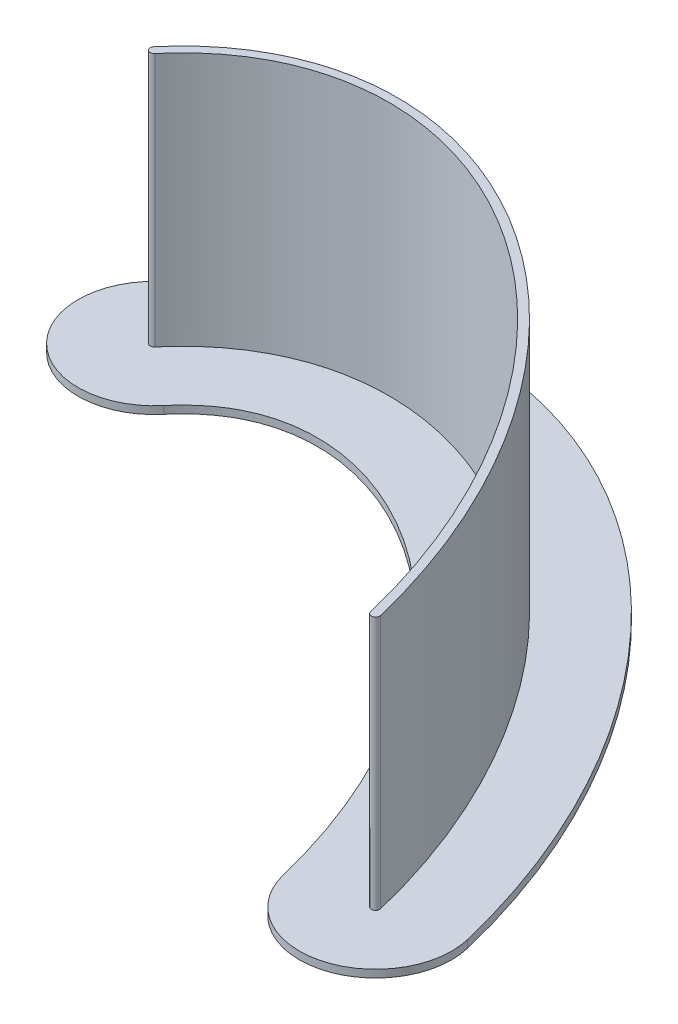
ISO-10303-21;
HEADER;
FILE_DESCRIPTION(('STEP AP214'),'2;1');
FILE_NAME('part.step','',(''),(''),'','','');
FILE_SCHEMA(('AUTOMOTIVE_DESIGN { 1 0 10303 214 1 1 1 1 }'));
ENDSEC;
DATA;
#1=APPLICATION_CONTEXT('core data for automotive mechanical design processes');
#2=APPLICATION_PROTOCOL_DEFINITION('international standard','automotive_design',2000,#1);
#3=PRODUCT_CONTEXT('',#1,'mechanical');
#4=PRODUCT('Part','Part','',(#3));
#5=PRODUCT_RELATED_PRODUCT_CATEGORY('part','',(#4));
#6=PRODUCT_DEFINITION_FORMATION('','',#4);
#7=PRODUCT_DEFINITION_CONTEXT('part definition',#1,'design');
#8=PRODUCT_DEFINITION('design','',#6,#7);
#9=PRODUCT_DEFINITION_SHAPE('','',#8);
#10=(LENGTH_UNIT() NAMED_UNIT(*) SI_UNIT(.MILLI.,.METRE.));
#11=(NAMED_UNIT(*) PLANE_ANGLE_UNIT() SI_UNIT($,.RADIAN.));
#12=(NAMED_UNIT(*) SI_UNIT($,.STERADIAN.) SOLID_ANGLE_UNIT());
#13=UNCERTAINTY_MEASURE_WITH_UNIT(LENGTH_MEASURE(1.E-05),#10,'distance_accuracy_value','');
#14=(GEOMETRIC_REPRESENTATION_CONTEXT(3) GLOBAL_UNCERTAINTY_ASSIGNED_CONTEXT((#13)) GLOBAL_UNIT_ASSIGNED_CONTEXT((#10,
#11,#12)) REPRESENTATION_CONTEXT('',''));
#15=CARTESIAN_POINT('',(0.,0.,0.));
#16=DIRECTION('',(0.,0.,1.));
#17=DIRECTION('',(1.,0.,0.));
#18=AXIS2_PLACEMENT_3D('',#15,#16,#17);
#19=CARTESIAN_POINT('',(23.8437160324077,100.,0.));
#20=DIRECTION('',(0.,-1.,0.));
#21=DIRECTION('',(0.,0.,-1.));
#22=AXIS2_PLACEMENT_3D('',#19,#20,#21);
#23=CYLINDRICAL_SURFACE('',#22,1.65);
#24=CARTESIAN_POINT('',(23.8437160324077,0.,0.));
#25=DIRECTION('',(0.,-1.,0.));
#26=DIRECTION('',(0.,0.,-1.));
#27=AXIS2_PLACEMENT_3D('',#24,#25,#26);
#28=CIRCLE('',#27,1.65);
#29=CARTESIAN_POINT('',(25.4477931258082,0.,-0.386570405524836));
#30=VERTEX_POINT('',#29);
#31=CARTESIAN_POINT('',(22.2396389390071,0.,0.386570405524822));
#32=VERTEX_POINT('',#31);
#33=EDGE_CURVE('E127',#30,#32,#28,.T.);
#34=ORIENTED_EDGE('',*,*,#33,.F.);
#35=DIRECTION('',(0.,-1.,0.));
#36=VECTOR('',#35,1.);
#37=CARTESIAN_POINT('',(25.4477931258082,100.,-0.386570405524836));
#38=LINE('',#37,#36);
#39=CARTESIAN_POINT('',(25.4477931258082,100.,-0.386570405524836));
#40=VERTEX_POINT('',#39);
#41=EDGE_CURVE('E11',#40,#30,#38,.T.);
#42=ORIENTED_EDGE('',*,*,#41,.F.);
#43=CARTESIAN_POINT('',(23.8437160324077,100.,0.));
#44=DIRECTION('',(0.,-1.,0.));
#45=DIRECTION('',(0.,0.,-1.));
#46=AXIS2_PLACEMENT_3D('',#43,#44,#45);
#47=CIRCLE('',#46,1.65);
#48=CARTESIAN_POINT('',(22.2396389390071,100.,0.386570405524822));
#49=VERTEX_POINT('',#48);
#50=EDGE_CURVE('E135',#40,#49,#47,.T.);
#51=ORIENTED_EDGE('',*,*,#50,.T.);
#52=DIRECTION('',(0.,-1.,0.));
#53=VECTOR('',#52,1.);
#54=CARTESIAN_POINT('',(22.2396389390071,100.,0.386570405524822));
#55=LINE('',#54,#53);
#56=EDGE_CURVE('E43',#49,#32,#55,.T.);
#57=ORIENTED_EDGE('',*,*,#56,.T.);
#58=EDGE_LOOP('',(#34,#42,#51,#57));
#59=FACE_BOUND('',#58,.T.);
#60=ADVANCED_FACE('F40',(#59),#23,.T.);
#61=CARTESIAN_POINT('',(25.4477931258082,100.,-0.386570405524836));
#62=CARTESIAN_POINT('',(24.4694232160074,100.,-4.44632443416856));
#63=CARTESIAN_POINT('',(22.3332246951575,100.,-12.4961436246533));
#64=CARTESIAN_POINT('',(17.2789819965973,100.,-28.5920377159451));
#65=CARTESIAN_POINT('',(9.5755850675518,100.,-48.4088645311104));
#66=CARTESIAN_POINT('',(-1.73211378860402,100.,-71.3256657640155));
#67=CARTESIAN_POINT('',(-19.2828551721138,100.,-100.164756935872));
#68=CARTESIAN_POINT('',(-45.2854993382414,100.,-132.010247367203));
#69=CARTESIAN_POINT('',(-80.7879387641448,100.,-160.741243666613));
#70=CARTESIAN_POINT('',(-111.866153701193,100.,-175.039124583876));
#71=CARTESIAN_POINT('',(-136.310465656965,100.,-180.046556902183));
#72=CARTESIAN_POINT('',(-154.101500743674,100.,-180.513328395677));
#73=CARTESIAN_POINT('',(-171.016980761169,100.,-177.663303296345));
#74=CARTESIAN_POINT('',(-184.108550636571,100.,-172.560778180515));
#75=CARTESIAN_POINT('',(-193.824522275518,100.,-166.90165353543));
#76=CARTESIAN_POINT('',(-200.696906081237,100.,-161.892236401554));
#77=CARTESIAN_POINT('',(-206.053892171736,100.,-157.09761574434));
#78=CARTESIAN_POINT('',(-210.096059890183,100.,-152.912239241576));
#79=CARTESIAN_POINT('',(-212.044923281908,100.,-150.692258471442));
#80=CARTESIAN_POINT('',(-212.989367198349,100.,-149.564718826624));
#81=B_SPLINE_CURVE_WITH_KNOTS('',3,(#61,#62,#63,#64,#65,#66,#67,#68,#69,#70,#71,#72,#73,#74,#75,
#76,#77,#78,#79,#80),.UNSPECIFIED.,.F.,.F.,(4,1,1,1,1,1,1,1,1,1,1,1,1,1,1,1,1,4),
(1.28539181245906,1.35286581842064,1.42033982438222,1.55528783630538,1.69023584822854,
1.82518386015171,2.09507988399803,2.36497590784436,2.63487193169069,2.76981994361385,
2.90476795553701,3.03971596746018,3.17466397938334,3.24213798534492,3.3096119913065,
3.37708599726808,3.41082300024888,3.44456000322967),.UNSPECIFIED.);
#82=DIRECTION('',(0.,-1.,0.));
#83=VECTOR('',#82,1.);
#84=SURFACE_OF_LINEAR_EXTRUSION('',#81,#83);
#85=CARTESIAN_POINT('',(25.4477931258082,0.,-0.386570405524836));
#86=CARTESIAN_POINT('',(24.4694232160074,0.,-4.44632443416856));
#87=CARTESIAN_POINT('',(22.3332246951575,0.,-12.4961436246533));
#88=CARTESIAN_POINT('',(17.2789819965973,0.,-28.5920377159451));
#89=CARTESIAN_POINT('',(9.5755850675518,0.,-48.4088645311104));
#90=CARTESIAN_POINT('',(-1.73211378860402,0.,-71.3256657640155));
#91=CARTESIAN_POINT('',(-19.2828551721138,0.,-100.164756935872));
#92=CARTESIAN_POINT('',(-45.2854993382414,0.,-132.010247367203));
#93=CARTESIAN_POINT('',(-80.7879387641448,0.,-160.741243666613));
#94=CARTESIAN_POINT('',(-111.866153701193,0.,-175.039124583876));
#95=CARTESIAN_POINT('',(-136.310465656965,0.,-180.046556902183));
#96=CARTESIAN_POINT('',(-154.101500743674,0.,-180.513328395677));
#97=CARTESIAN_POINT('',(-171.016980761169,0.,-177.663303296345));
#98=CARTESIAN_POINT('',(-184.108550636571,0.,-172.560778180515));
#99=CARTESIAN_POINT('',(-193.824522275518,0.,-166.90165353543));
#100=CARTESIAN_POINT('',(-200.696906081237,0.,-161.892236401554));
#101=CARTESIAN_POINT('',(-206.053892171736,0.,-157.09761574434));
#102=CARTESIAN_POINT('',(-210.096059890183,0.,-152.912239241576));
#103=CARTESIAN_POINT('',(-212.044923281908,0.,-150.692258471442));
#104=CARTESIAN_POINT('',(-212.989367198349,0.,-149.564718826624));
#105=B_SPLINE_CURVE_WITH_KNOTS('',3,(#85,#86,#87,#88,#89,#90,#91,#92,#93,#94,#95,#96,#97,#98,
#99,#100,#101,#102,#103,#104),.UNSPECIFIED.,.F.,.F.,(4,1,1,1,1,1,1,1,1,1,1,1,1,1,1,1,1,4),
(1.28539181245906,1.35286581842064,1.42033982438222,1.55528783630538,1.69023584822854,
1.82518386015171,2.09507988399803,2.36497590784436,2.63487193169069,2.76981994361385,
2.90476795553701,3.03971596746018,3.17466397938334,3.24213798534492,3.3096119913065,
3.37708599726808,3.41082300024888,3.44456000322967),.UNSPECIFIED.);
#106=CARTESIAN_POINT('',(-212.989367198349,0.,-149.564718826624));
#107=VERTEX_POINT('',#106);
#108=EDGE_CURVE('E138',#30,#107,#105,.T.);
#109=ORIENTED_EDGE('',*,*,#108,.T.);
#110=DIRECTION('',(0.,-1.,0.));
#111=VECTOR('',#110,1.);
#112=CARTESIAN_POINT('',(-212.989367198349,100.,-149.564718826624));
#113=LINE('',#112,#111);
#114=CARTESIAN_POINT('',(-212.989367198349,100.,-149.564718826624));
#115=VERTEX_POINT('',#114);
#116=EDGE_CURVE('E50',#115,#107,#113,.T.);
#117=ORIENTED_EDGE('',*,*,#116,.F.);
#118=EDGE_CURVE('E163',#40,#115,#81,.T.);
#119=ORIENTED_EDGE('',*,*,#118,.F.);
#120=ORIENTED_EDGE('',*,*,#41,.T.);
#121=EDGE_LOOP('',(#109,#117,#119,#120));
#122=FACE_BOUND('',#121,.T.);
#123=ADVANCED_FACE('F157',(#122),#84,.F.);
#124=CARTESIAN_POINT('',(-211.724469547056,100.,-148.505221808339));
#125=DIRECTION('',(0.,-1.,0.));
#126=DIRECTION('',(0.,0.,-1.));
#127=AXIS2_PLACEMENT_3D('',#124,#125,#126);
#128=CYLINDRICAL_SURFACE('',#127,1.64999999999999);
#129=CARTESIAN_POINT('',(-211.724469547056,0.,-148.505221808339));
#130=DIRECTION('',(0.,1.,0.));
#131=DIRECTION('',(0.,0.,1.));
#132=AXIS2_PLACEMENT_3D('',#129,#130,#131);
#133=CIRCLE('',#132,1.64999999999999);
#134=CARTESIAN_POINT('',(-210.459571895763,0.,-147.445724790054));
#135=VERTEX_POINT('',#134);
#136=EDGE_CURVE('E174',#107,#135,#133,.T.);
#137=ORIENTED_EDGE('',*,*,#136,.T.);
#138=DIRECTION('',(0.,-1.,0.));
#139=VECTOR('',#138,1.);
#140=CARTESIAN_POINT('',(-210.459571895763,100.,-147.445724790054));
#141=LINE('',#140,#139);
#142=CARTESIAN_POINT('',(-210.459571895763,100.,-147.445724790054));
#143=VERTEX_POINT('',#142);
#144=EDGE_CURVE('E189',#143,#135,#141,.T.);
#145=ORIENTED_EDGE('',*,*,#144,.F.);
#146=CARTESIAN_POINT('',(-211.724469547056,100.,-148.505221808339));
#147=DIRECTION('',(0.,1.,0.));
#148=DIRECTION('',(0.,0.,1.));
#149=AXIS2_PLACEMENT_3D('',#146,#147,#148);
#150=CIRCLE('',#149,1.64999999999999);
#151=EDGE_CURVE('E144',#115,#143,#150,.T.);
#152=ORIENTED_EDGE('',*,*,#151,.F.);
#153=ORIENTED_EDGE('',*,*,#116,.T.);
#154=EDGE_LOOP('',(#137,#145,#152,#153));
#155=FACE_BOUND('',#154,.T.);
#156=ADVANCED_FACE('F153',(#155),#128,.T.);
#157=CARTESIAN_POINT('',(22.2396389390071,100.,0.386570405524822));
#158=CARTESIAN_POINT('',(21.7574780483549,100.,-1.61416019613306));
#159=CARTESIAN_POINT('',(20.7491217186037,100.,-5.59730233410935));
#160=CARTESIAN_POINT('',(18.536030084947,100.,-13.5745915292982));
#161=CARTESIAN_POINT('',(14.1686947735456,100.,-27.4797431885373));
#162=CARTESIAN_POINT('',(6.55084033701872,100.,-47.079936230781));
#163=CARTESIAN_POINT('',(-4.62844230395852,100.,-69.7349075521782));
#164=CARTESIAN_POINT('',(-21.9755685589893,100.,-98.239463114523));
#165=CARTESIAN_POINT('',(-47.651343303746,100.,-129.677792921262));
#166=CARTESIAN_POINT('',(-82.5918724007901,100.,-157.938934972464));
#167=CARTESIAN_POINT('',(-112.981407163899,100.,-171.898903888157));
#168=CARTESIAN_POINT('',(-136.706178936931,100.,-176.753073489288));
#169=CARTESIAN_POINT('',(-153.882706061256,100.,-177.199770960146));
#170=CARTESIAN_POINT('',(-170.139849975352,100.,-174.457544689323));
#171=CARTESIAN_POINT('',(-182.693050278325,100.,-169.564346218918));
#172=CARTESIAN_POINT('',(-192.015134761759,100.,-164.134990799414));
#173=CARTESIAN_POINT('',(-198.616330487379,100.,-159.323630190259));
#174=CARTESIAN_POINT('',(-203.771296985946,100.,-154.710229963631));
#175=CARTESIAN_POINT('',(-207.666830264653,100.,-150.67686145865));
#176=CARTESIAN_POINT('',(-209.548220455634,100.,-148.533756446801));
#177=CARTESIAN_POINT('',(-210.459571895763,100.,-147.445724790054));
#178=B_SPLINE_CURVE_WITH_KNOTS('',3,(#157,#158,#159,#160,#161,#162,#163,#164,#165,#166,#167,
#168,#169,#170,#171,#172,#173,#174,#175,#176,#177),.UNSPECIFIED.,.F.,.F.,(4,1,1,1,1,1,1,1,1,1,1,
1,1,1,1,1,1,1,4),(1.28539181245906,1.31912881543985,1.35286581842064,1.42033982438222,
1.55528783630538,1.69023584822854,1.82518386015171,2.09507988399803,2.36497590784436,
2.63487193169069,2.76981994361385,2.90476795553701,3.03971596746018,3.17466397938334,
3.24213798534492,3.3096119913065,3.37708599726808,3.41082300024888,3.44456000322967),.UNSPECIFIED.);
#179=DIRECTION('',(0.,-1.,0.));
#180=VECTOR('',#179,1.);
#181=SURFACE_OF_LINEAR_EXTRUSION('',#178,#180);
#182=CARTESIAN_POINT('',(22.2396389390071,0.,0.386570405524822));
#183=CARTESIAN_POINT('',(21.7574780483549,0.,-1.61416019613306));
#184=CARTESIAN_POINT('',(20.7491217186037,0.,-5.59730233410935));
#185=CARTESIAN_POINT('',(18.536030084947,0.,-13.5745915292982));
#186=CARTESIAN_POINT('',(14.1686947735456,0.,-27.4797431885373));
#187=CARTESIAN_POINT('',(6.55084033701872,0.,-47.079936230781));
#188=CARTESIAN_POINT('',(-4.62844230395852,0.,-69.7349075521782));
#189=CARTESIAN_POINT('',(-21.9755685589893,0.,-98.239463114523));
#190=CARTESIAN_POINT('',(-47.651343303746,0.,-129.677792921262));
#191=CARTESIAN_POINT('',(-82.5918724007901,0.,-157.938934972464));
#192=CARTESIAN_POINT('',(-112.981407163899,0.,-171.898903888157));
#193=CARTESIAN_POINT('',(-136.706178936931,0.,-176.753073489288));
#194=CARTESIAN_POINT('',(-153.882706061256,0.,-177.199770960146));
#195=CARTESIAN_POINT('',(-170.139849975352,0.,-174.457544689323));
#196=CARTESIAN_POINT('',(-182.693050278325,0.,-169.564346218918));
#197=CARTESIAN_POINT('',(-192.015134761759,0.,-164.134990799414));
#198=CARTESIAN_POINT('',(-198.616330487379,0.,-159.323630190259));
#199=CARTESIAN_POINT('',(-203.771296985946,0.,-154.710229963631));
#200=CARTESIAN_POINT('',(-207.666830264653,0.,-150.67686145865));
#201=CARTESIAN_POINT('',(-209.548220455634,0.,-148.533756446801));
#202=CARTESIAN_POINT('',(-210.459571895763,0.,-147.445724790054));
#203=B_SPLINE_CURVE_WITH_KNOTS('',3,(#182,#183,#184,#185,#186,#187,#188,#189,#190,#191,#192,
#193,#194,#195,#196,#197,#198,#199,#200,#201,#202),.UNSPECIFIED.,.F.,.F.,(4,1,1,1,1,1,1,1,1,1,1,
1,1,1,1,1,1,1,4),(1.28539181245906,1.31912881543985,1.35286581842064,1.42033982438222,
1.55528783630538,1.69023584822854,1.82518386015171,2.09507988399803,2.36497590784436,
2.63487193169069,2.76981994361385,2.90476795553701,3.03971596746018,3.17466397938334,
3.24213798534492,3.3096119913065,3.37708599726808,3.41082300024888,3.44456000322967),.UNSPECIFIED.);
#204=EDGE_CURVE('E129',#32,#135,#203,.T.);
#205=ORIENTED_EDGE('',*,*,#204,.F.);
#206=ORIENTED_EDGE('',*,*,#56,.F.);
#207=EDGE_CURVE('E137',#49,#143,#178,.T.);
#208=ORIENTED_EDGE('',*,*,#207,.T.);
#209=ORIENTED_EDGE('',*,*,#144,.T.);
#210=EDGE_LOOP('',(#205,#206,#208,#209));
#211=FACE_BOUND('',#210,.T.);
#212=ADVANCED_FACE('F149',(#211),#181,.T.);
#213=CARTESIAN_POINT('',(23.8437160324077,100.,0.));
#214=DIRECTION('',(0.,-1.,0.));
#215=DIRECTION('',(0.,0.,-1.));
#216=AXIS2_PLACEMENT_3D('',#213,#214,#215);
#217=PLANE('',#216);
#218=ORIENTED_EDGE('',*,*,#50,.F.);
#219=ORIENTED_EDGE('',*,*,#118,.T.);
#220=ORIENTED_EDGE('',*,*,#151,.T.);
#221=ORIENTED_EDGE('',*,*,#207,.F.);
#222=EDGE_LOOP('',(#218,#219,#220,#221));
#223=FACE_BOUND('',#222,.T.);
#224=ADVANCED_FACE('F152',(#223),#217,.F.);
#225=CARTESIAN_POINT('',(23.8437160324077,0.,0.));
#226=DIRECTION('',(0.,-1.,0.));
#227=DIRECTION('',(0.,0.,-1.));
#228=AXIS2_PLACEMENT_3D('',#225,#226,#227);
#229=PLANE('',#228);
#230=CARTESIAN_POINT('',(23.8437160324077,0.,0.));
#231=DIRECTION('',(0.,-1.,0.));
#232=DIRECTION('',(0.,0.,-1.));
#233=AXIS2_PLACEMENT_3D('',#230,#231,#232);
#234=CIRCLE('',#233,30.);
#235=CARTESIAN_POINT('',(53.0087540942359,0.,-7.02855282772418));
#236=VERTEX_POINT('',#235);
#237=CARTESIAN_POINT('',(-5.32132202942056,0.,7.02855282772417));
#238=VERTEX_POINT('',#237);
#239=EDGE_CURVE('E126',#236,#238,#234,.T.);
#240=ORIENTED_EDGE('',*,*,#239,.F.);
#241=CARTESIAN_POINT('',(53.0087540942359,0.,-7.02855282772418));
#242=CARTESIAN_POINT('',(51.9298173992771,0.,-11.50560956274));
#243=CARTESIAN_POINT('',(49.5718415081094,0.,-20.39092903957));
#244=CARTESIAN_POINT('',(44.0123541357329,0.,-38.0932645813936));
#245=CARTESIAN_POINT('',(35.5564226638113,0.,-59.844015848891));
#246=CARTESIAN_POINT('',(23.1511520995094,0.,-84.9868915247273));
#247=CARTESIAN_POINT('',(3.84932476501022,0.,-116.707571722486));
#248=CARTESIAN_POINT('',(-24.9605196872148,0.,-152.04720323794));
#249=CARTESIAN_POINT('',(-65.290568749197,0.,-184.815877475255));
#250=CARTESIAN_POINT('',(-102.285114038752,0.,-202.016459153982));
#251=CARTESIAN_POINT('',(-132.910914261829,0.,-208.340551294242));
#252=CARTESIAN_POINT('',(-155.981206851905,0.,-208.97990540826));
#253=CARTESIAN_POINT('',(-178.552102655834,0.,-205.20328099149));
#254=CARTESIAN_POINT('',(-199.813171224792,0.,-196.924192444602));
#255=CARTESIAN_POINT('',(-215.737282567278,0.,-186.496778706747));
#256=CARTESIAN_POINT('',(-227.077525577877,0.,-176.342226423577));
#257=CARTESIAN_POINT('',(-232.269234057774,0.,-170.697804909798));
#258=CARTESIAN_POINT('',(-234.722608661469,0.,-167.76880395897));
#259=B_SPLINE_CURVE_WITH_KNOTS('',3,(#241,#242,#243,#244,#245,#246,#247,#248,#249,#250,#251,
#252,#253,#254,#255,#256,#257,#258),.UNSPECIFIED.,.F.,.F.,(4,1,1,1,1,1,1,1,1,1,1,1,1,1,1,4),
(1.28539181245906,1.35286581842064,1.42033982438222,1.55528783630538,1.69023584822854,
1.82518386015171,2.09507988399803,2.36497590784436,2.63487193169069,2.76981994361385,
2.90476795553701,3.03971596746018,3.17466397938334,3.3096119913065,3.37708599726808,
3.44456000322967),.UNSPECIFIED.);
#260=CARTESIAN_POINT('',(-234.722608661469,0.,-167.76880395897));
#261=VERTEX_POINT('',#260);
#262=EDGE_CURVE('E122',#236,#261,#259,.T.);
#263=ORIENTED_EDGE('',*,*,#262,.T.);
#264=CARTESIAN_POINT('',(-211.724469547056,0.,-148.505221808339));
#265=DIRECTION('',(0.,1.,0.));
#266=DIRECTION('',(0.,0.,1.));
#267=AXIS2_PLACEMENT_3D('',#264,#265,#266);
#268=CIRCLE('',#267,30.);
#269=CARTESIAN_POINT('',(-188.726330432643,0.,-129.241639657708));
#270=VERTEX_POINT('',#269);
#271=EDGE_CURVE('E297',#261,#270,#268,.T.);
#272=ORIENTED_EDGE('',*,*,#271,.T.);
#273=CARTESIAN_POINT('',(-5.32132202942056,0.,7.02855282772417));
#274=CARTESIAN_POINT('',(-5.75295061327709,0.,5.23750645085218));
#275=CARTESIAN_POINT('',(-6.65503746916926,0.,1.67411092603046));
#276=CARTESIAN_POINT('',(-8.63987789986846,0.,-5.48087827765092));
#277=CARTESIAN_POINT('',(-11.4431109048436,0.,-14.4065954102905));
#278=CARTESIAN_POINT('',(-15.3105258686105,0.,-25.0451679907293));
#279=CARTESIAN_POINT('',(-21.1104436070733,0.,-39.0495178598051));
#280=CARTESIAN_POINT('',(-29.511654733025,0.,-56.0737094295436));
#281=CARTESIAN_POINT('',(-45.1077792671899,0.,-81.6966322016626));
#282=CARTESIAN_POINT('',(-67.9763133103182,0.,-109.64084399636));
#283=CARTESIAN_POINT('',(-98.0892421393724,0.,-133.864294121145));
#284=CARTESIAN_POINT('',(-122.562455738544,0.,-144.921585831665));
#285=CARTESIAN_POINT('',(-140.105714345374,0.,-148.459050781257));
#286=CARTESIAN_POINT('',(-152.003061212314,0.,-148.733301905231));
#287=CARTESIAN_POINT('',(-162.604499030225,0.,-146.917163479477));
#288=CARTESIAN_POINT('',(-170.532615395322,0.,-143.822271695513));
#289=CARTESIAN_POINT('',(-176.470851118381,0.,-140.3668427386));
#290=CARTESIAN_POINT('',(-180.742294704554,0.,-137.256967741427));
#291=CARTESIAN_POINT('',(-184.161729253068,0.,-134.200415756661));
#292=CARTESIAN_POINT('',(-186.797539391376,0.,-131.472934141076));
#293=CARTESIAN_POINT('',(-188.099273446825,0.,-129.990261782074));
#294=CARTESIAN_POINT('',(-188.726330432643,0.,-129.241639657708));
#295=B_SPLINE_CURVE_WITH_KNOTS('',3,(#273,#274,#275,#276,#277,#278,#279,#280,#281,#282,#283,
#284,#285,#286,#287,#288,#289,#290,#291,#292,#293,#294),.UNSPECIFIED.,.F.,.F.,(4,1,1,1,1,1,1,1,
1,1,1,1,1,1,1,1,1,1,1,4),(1.28539181245906,1.31912881543985,1.35286581842064,1.42033982438222,
1.4878138303438,1.55528783630538,1.69023584822854,1.82518386015171,2.09507988399803,
2.36497590784436,2.63487193169069,2.76981994361385,2.90476795553701,3.03971596746018,
3.17466397938334,3.24213798534492,3.3096119913065,3.37708599726808,3.41082300024888,
3.44456000322967),.UNSPECIFIED.);
#296=EDGE_CURVE('E293',#238,#270,#295,.T.);
#297=ORIENTED_EDGE('',*,*,#296,.F.);
#298=EDGE_LOOP('',(#240,#263,#272,#297));
#299=FACE_BOUND('',#298,.T.);
#300=ORIENTED_EDGE('',*,*,#108,.F.);
#301=ORIENTED_EDGE('',*,*,#33,.T.);
#302=ORIENTED_EDGE('',*,*,#204,.T.);
#303=ORIENTED_EDGE('',*,*,#136,.F.);
#304=EDGE_LOOP('',(#300,#301,#302,#303));
#305=FACE_BOUND('',#304,.T.);
#306=ADVANCED_FACE('F203',(#299,#305),#229,.F.);
#307=CARTESIAN_POINT('',(23.8437160324077,-3.,0.));
#308=DIRECTION('',(0.,1.,0.));
#309=DIRECTION('',(0.,0.,1.));
#310=AXIS2_PLACEMENT_3D('',#307,#308,#309);
#311=CYLINDRICAL_SURFACE('',#310,30.);
#312=ORIENTED_EDGE('',*,*,#239,.T.);
#313=DIRECTION('',(0.,1.,0.));
#314=VECTOR('',#313,1.);
#315=CARTESIAN_POINT('',(-5.32132202942056,-3.,7.02855282772417));
#316=LINE('',#315,#314);
#317=CARTESIAN_POINT('',(-5.32132202942056,-3.,7.02855282772417));
#318=VERTEX_POINT('',#317);
#319=EDGE_CURVE('E107',#318,#238,#316,.T.);
#320=ORIENTED_EDGE('',*,*,#319,.F.);
#321=CARTESIAN_POINT('',(23.8437160324077,-3.,0.));
#322=DIRECTION('',(0.,-1.,0.));
#323=DIRECTION('',(0.,0.,-1.));
#324=AXIS2_PLACEMENT_3D('',#321,#322,#323);
#325=CIRCLE('',#324,30.);
#326=CARTESIAN_POINT('',(53.0087540942359,-3.,-7.02855282772418));
#327=VERTEX_POINT('',#326);
#328=EDGE_CURVE('E114',#327,#318,#325,.T.);
#329=ORIENTED_EDGE('',*,*,#328,.F.);
#330=DIRECTION('',(0.,1.,0.));
#331=VECTOR('',#330,1.);
#332=CARTESIAN_POINT('',(53.0087540942359,-3.,-7.02855282772418));
#333=LINE('',#332,#331);
#334=EDGE_CURVE('E288',#327,#236,#333,.T.);
#335=ORIENTED_EDGE('',*,*,#334,.T.);
#336=EDGE_LOOP('',(#312,#320,#329,#335));
#337=FACE_BOUND('',#336,.T.);
#338=ADVANCED_FACE('F124',(#337),#311,.T.);
#339=CARTESIAN_POINT('',(-5.32132202942056,-3.,7.02855282772417));
#340=CARTESIAN_POINT('',(-5.75295061327709,-3.,5.23750645085218));
#341=CARTESIAN_POINT('',(-6.65503746916926,-3.,1.67411092603046));
#342=CARTESIAN_POINT('',(-8.63987789986846,-3.,-5.48087827765092));
#343=CARTESIAN_POINT('',(-11.4431109048436,-3.,-14.4065954102905));
#344=CARTESIAN_POINT('',(-15.3105258686105,-3.,-25.0451679907293));
#345=CARTESIAN_POINT('',(-21.1104436070733,-3.,-39.0495178598051));
#346=CARTESIAN_POINT('',(-29.511654733025,-3.,-56.0737094295436));
#347=CARTESIAN_POINT('',(-45.1077792671899,-3.,-81.6966322016626));
#348=CARTESIAN_POINT('',(-67.9763133103182,-3.,-109.64084399636));
#349=CARTESIAN_POINT('',(-98.0892421393724,-3.,-133.864294121145));
#350=CARTESIAN_POINT('',(-122.562455738544,-3.,-144.921585831665));
#351=CARTESIAN_POINT('',(-140.105714345374,-3.,-148.459050781257));
#352=CARTESIAN_POINT('',(-152.003061212314,-3.,-148.733301905231));
#353=CARTESIAN_POINT('',(-162.604499030225,-3.,-146.917163479477));
#354=CARTESIAN_POINT('',(-170.532615395322,-3.,-143.822271695513));
#355=CARTESIAN_POINT('',(-176.470851118381,-3.,-140.3668427386));
#356=CARTESIAN_POINT('',(-180.742294704554,-3.,-137.256967741427));
#357=CARTESIAN_POINT('',(-184.161729253068,-3.,-134.200415756661));
#358=CARTESIAN_POINT('',(-186.797539391376,-3.,-131.472934141076));
#359=CARTESIAN_POINT('',(-188.099273446825,-3.,-129.990261782074));
#360=CARTESIAN_POINT('',(-188.726330432643,-3.,-129.241639657708));
#361=B_SPLINE_CURVE_WITH_KNOTS('',3,(#339,#340,#341,#342,#343,#344,#345,#346,#347,#348,#349,
#350,#351,#352,#353,#354,#355,#356,#357,#358,#359,#360),.UNSPECIFIED.,.F.,.F.,(4,1,1,1,1,1,1,1,
1,1,1,1,1,1,1,1,1,1,1,4),(1.28539181245906,1.31912881543985,1.35286581842064,1.42033982438222,
1.4878138303438,1.55528783630538,1.69023584822854,1.82518386015171,2.09507988399803,
2.36497590784436,2.63487193169069,2.76981994361385,2.90476795553701,3.03971596746018,
3.17466397938334,3.24213798534492,3.3096119913065,3.37708599726808,3.41082300024888,
3.44456000322967),.UNSPECIFIED.);
#362=DIRECTION('',(0.,1.,0.));
#363=VECTOR('',#362,1.);
#364=SURFACE_OF_LINEAR_EXTRUSION('',#361,#363);
#365=ORIENTED_EDGE('',*,*,#296,.T.);
#366=DIRECTION('',(0.,1.,0.));
#367=VECTOR('',#366,1.);
#368=CARTESIAN_POINT('',(-188.726330432643,-3.,-129.241639657708));
#369=LINE('',#368,#367);
#370=CARTESIAN_POINT('',(-188.726330432643,-3.,-129.241639657708));
#371=VERTEX_POINT('',#370);
#372=EDGE_CURVE('E109',#371,#270,#369,.T.);
#373=ORIENTED_EDGE('',*,*,#372,.F.);
#374=EDGE_CURVE('E102',#318,#371,#361,.T.);
#375=ORIENTED_EDGE('',*,*,#374,.F.);
#376=ORIENTED_EDGE('',*,*,#319,.T.);
#377=EDGE_LOOP('',(#365,#373,#375,#376));
#378=FACE_BOUND('',#377,.T.);
#379=ADVANCED_FACE('F105',(#378),#364,.F.);
#380=CARTESIAN_POINT('',(-211.724469547056,-3.,-148.505221808339));
#381=DIRECTION('',(0.,1.,0.));
#382=DIRECTION('',(0.,0.,1.));
#383=AXIS2_PLACEMENT_3D('',#380,#381,#382);
#384=CYLINDRICAL_SURFACE('',#383,30.);
#385=ORIENTED_EDGE('',*,*,#271,.F.);
#386=DIRECTION('',(0.,1.,0.));
#387=VECTOR('',#386,1.);
#388=CARTESIAN_POINT('',(-234.722608661469,-3.,-167.76880395897));
#389=LINE('',#388,#387);
#390=CARTESIAN_POINT('',(-234.722608661469,-3.,-167.76880395897));
#391=VERTEX_POINT('',#390);
#392=EDGE_CURVE('E131',#391,#261,#389,.T.);
#393=ORIENTED_EDGE('',*,*,#392,.F.);
#394=CARTESIAN_POINT('',(-211.724469547056,-3.,-148.505221808339));
#395=DIRECTION('',(0.,1.,0.));
#396=DIRECTION('',(0.,0.,1.));
#397=AXIS2_PLACEMENT_3D('',#394,#395,#396);
#398=CIRCLE('',#397,30.);
#399=EDGE_CURVE('E113',#391,#371,#398,.T.);
#400=ORIENTED_EDGE('',*,*,#399,.T.);
#401=ORIENTED_EDGE('',*,*,#372,.T.);
#402=EDGE_LOOP('',(#385,#393,#400,#401));
#403=FACE_BOUND('',#402,.T.);
#404=ADVANCED_FACE('F251',(#403),#384,.T.);
#405=CARTESIAN_POINT('',(53.0087540942359,-3.,-7.02855282772418));
#406=CARTESIAN_POINT('',(51.9298173992771,-3.,-11.50560956274));
#407=CARTESIAN_POINT('',(49.5718415081094,-3.,-20.39092903957));
#408=CARTESIAN_POINT('',(44.0123541357329,-3.,-38.0932645813936));
#409=CARTESIAN_POINT('',(35.5564226638113,-3.,-59.844015848891));
#410=CARTESIAN_POINT('',(23.1511520995094,-3.,-84.9868915247273));
#411=CARTESIAN_POINT('',(3.84932476501022,-3.,-116.707571722486));
#412=CARTESIAN_POINT('',(-24.9605196872148,-3.,-152.04720323794));
#413=CARTESIAN_POINT('',(-65.290568749197,-3.,-184.815877475255));
#414=CARTESIAN_POINT('',(-102.285114038752,-3.,-202.016459153982));
#415=CARTESIAN_POINT('',(-132.910914261829,-3.,-208.340551294242));
#416=CARTESIAN_POINT('',(-155.981206851905,-3.,-208.97990540826));
#417=CARTESIAN_POINT('',(-178.552102655834,-3.,-205.20328099149));
#418=CARTESIAN_POINT('',(-199.813171224792,-3.,-196.924192444602));
#419=CARTESIAN_POINT('',(-215.737282567278,-3.,-186.496778706747));
#420=CARTESIAN_POINT('',(-227.077525577877,-3.,-176.342226423577));
#421=CARTESIAN_POINT('',(-232.269234057774,-3.,-170.697804909798));
#422=CARTESIAN_POINT('',(-234.722608661469,-3.,-167.76880395897));
#423=B_SPLINE_CURVE_WITH_KNOTS('',3,(#405,#406,#407,#408,#409,#410,#411,#412,#413,#414,#415,
#416,#417,#418,#419,#420,#421,#422),.UNSPECIFIED.,.F.,.F.,(4,1,1,1,1,1,1,1,1,1,1,1,1,1,1,4),
(1.28539181245906,1.35286581842064,1.42033982438222,1.55528783630538,1.69023584822854,
1.82518386015171,2.09507988399803,2.36497590784436,2.63487193169069,2.76981994361385,
2.90476795553701,3.03971596746018,3.17466397938334,3.3096119913065,3.37708599726808,
3.44456000322967),.UNSPECIFIED.);
#424=DIRECTION('',(0.,1.,0.));
#425=VECTOR('',#424,1.);
#426=SURFACE_OF_LINEAR_EXTRUSION('',#423,#425);
#427=ORIENTED_EDGE('',*,*,#262,.F.);
#428=ORIENTED_EDGE('',*,*,#334,.F.);
#429=EDGE_CURVE('E120',#327,#391,#423,.T.);
#430=ORIENTED_EDGE('',*,*,#429,.T.);
#431=ORIENTED_EDGE('',*,*,#392,.T.);
#432=EDGE_LOOP('',(#427,#428,#430,#431));
#433=FACE_BOUND('',#432,.T.);
#434=ADVANCED_FACE('F260',(#433),#426,.T.);
#435=CARTESIAN_POINT('',(23.8437160324077,-3.,0.));
#436=DIRECTION('',(0.,-1.,0.));
#437=DIRECTION('',(0.,0.,-1.));
#438=AXIS2_PLACEMENT_3D('',#435,#436,#437);
#439=PLANE('',#438);
#440=ORIENTED_EDGE('',*,*,#328,.T.);
#441=ORIENTED_EDGE('',*,*,#374,.T.);
#442=ORIENTED_EDGE('',*,*,#399,.F.);
#443=ORIENTED_EDGE('',*,*,#429,.F.);
#444=EDGE_LOOP('',(#440,#441,#442,#443));
#445=FACE_BOUND('',#444,.T.);
#446=ADVANCED_FACE('F118',(#445),#439,.T.);
#447=CLOSED_SHELL('',(#60,#123,#156,#212,#224,#306,#338,#379,#404,#434,#446));
#448=MANIFOLD_SOLID_BREP('B2',#447);
#449=ADVANCED_BREP_SHAPE_REPRESENTATION('',(#18,#448),#14);
#450=SHAPE_DEFINITION_REPRESENTATION(#9,#449);
ENDSEC;
END-ISO-10303-21;
